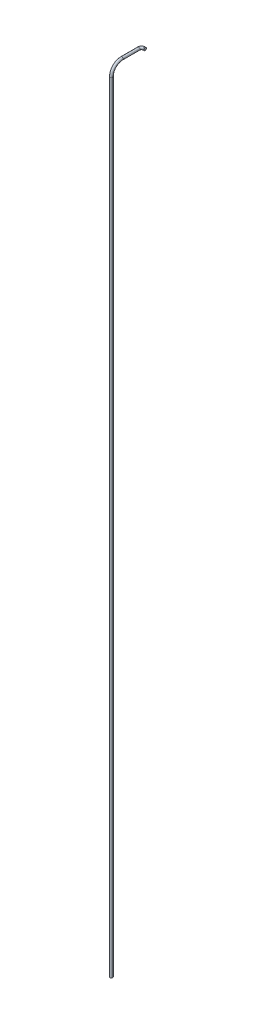
ISO-10303-21;
HEADER;
FILE_DESCRIPTION(('STEP AP214'),'2;1');
FILE_NAME('part.step','',(''),(''),'','','');
FILE_SCHEMA(('AUTOMOTIVE_DESIGN { 1 0 10303 214 1 1 1 1 }'));
ENDSEC;
DATA;
#1=APPLICATION_CONTEXT('core data for automotive mechanical design processes');
#2=APPLICATION_PROTOCOL_DEFINITION('international standard','automotive_design',2000,#1);
#3=PRODUCT_CONTEXT('',#1,'mechanical');
#4=PRODUCT('Part','Part','',(#3));
#5=PRODUCT_RELATED_PRODUCT_CATEGORY('part','',(#4));
#6=PRODUCT_DEFINITION_FORMATION('','',#4);
#7=PRODUCT_DEFINITION_CONTEXT('part definition',#1,'design');
#8=PRODUCT_DEFINITION('design','',#6,#7);
#9=PRODUCT_DEFINITION_SHAPE('','',#8);
#10=(LENGTH_UNIT() NAMED_UNIT(*) SI_UNIT(.MILLI.,.METRE.));
#11=(NAMED_UNIT(*) PLANE_ANGLE_UNIT() SI_UNIT($,.RADIAN.));
#12=(NAMED_UNIT(*) SI_UNIT($,.STERADIAN.) SOLID_ANGLE_UNIT());
#13=UNCERTAINTY_MEASURE_WITH_UNIT(LENGTH_MEASURE(1.E-05),#10,'distance_accuracy_value','');
#14=(GEOMETRIC_REPRESENTATION_CONTEXT(3) GLOBAL_UNCERTAINTY_ASSIGNED_CONTEXT((#13)) GLOBAL_UNIT_ASSIGNED_CONTEXT((#10,
#11,#12)) REPRESENTATION_CONTEXT('',''));
#15=CARTESIAN_POINT('',(0.,0.,0.));
#16=DIRECTION('',(0.,0.,1.));
#17=DIRECTION('',(1.,0.,0.));
#18=AXIS2_PLACEMENT_3D('',#15,#16,#17);
#19=CARTESIAN_POINT('',(0.,-1500.,49.9999999999998));
#20=DIRECTION('',(0.,1.,0.));
#21=DIRECTION('',(0.,0.,1.));
#22=AXIS2_PLACEMENT_3D('',#19,#20,#21);
#23=PLANE('',#22);
#24=CARTESIAN_POINT('',(0.,-1500.,49.9999999999998));
#25=DIRECTION('',(0.,1.,0.));
#26=DIRECTION('',(0.,0.,1.));
#27=AXIS2_PLACEMENT_3D('',#24,#25,#26);
#28=CIRCLE('',#27,2.5);
#29=CARTESIAN_POINT('',(0.,-1500.,52.4999999999998));
#30=VERTEX_POINT('',#29);
#31=EDGE_CURVE('E12',#30,#30,#28,.T.);
#32=ORIENTED_EDGE('',*,*,#31,.F.);
#33=EDGE_LOOP('',(#32));
#34=FACE_BOUND('',#33,.T.);
#35=ADVANCED_FACE('F58',(#34),#23,.F.);
#36=CARTESIAN_POINT('',(0.,0.,0.));
#37=DIRECTION('',(0.,0.,1.));
#38=DIRECTION('',(0.,-1.,0.));
#39=AXIS2_PLACEMENT_3D('',#36,#37,#38);
#40=CYLINDRICAL_SURFACE('',#39,2.5);
#41=CARTESIAN_POINT('',(0.,0.,30.));
#42=DIRECTION('',(0.,0.,-1.));
#43=DIRECTION('',(0.,1.,0.));
#44=AXIS2_PLACEMENT_3D('',#41,#42,#43);
#45=CIRCLE('',#44,2.5);
#46=CARTESIAN_POINT('',(0.,2.49999999999999,30.));
#47=VERTEX_POINT('',#46);
#48=EDGE_CURVE('E76',#47,#47,#45,.T.);
#49=ORIENTED_EDGE('',*,*,#48,.T.);
#50=EDGE_LOOP('',(#49));
#51=FACE_BOUND('',#50,.T.);
#52=CARTESIAN_POINT('',(0.,0.,-2.));
#53=DIRECTION('',(0.,0.,1.));
#54=DIRECTION('',(1.,0.,0.));
#55=AXIS2_PLACEMENT_3D('',#52,#53,#54);
#56=CIRCLE('',#55,2.5);
#57=CARTESIAN_POINT('',(-2.5,0.,-2.));
#58=VERTEX_POINT('',#57);
#59=EDGE_CURVE('E82',#58,#58,#56,.T.);
#60=ORIENTED_EDGE('',*,*,#59,.T.);
#61=EDGE_LOOP('',(#60));
#62=FACE_BOUND('',#61,.T.);
#63=ADVANCED_FACE('F100',(#51,#62),#40,.T.);
#64=CARTESIAN_POINT('',(0.,-20.,30.));
#65=DIRECTION('',(1.,0.,0.));
#66=DIRECTION('',(0.,0.,-1.));
#67=AXIS2_PLACEMENT_3D('',#64,#65,#66);
#68=TOROIDAL_SURFACE('',#67,20.,2.5);
#69=CARTESIAN_POINT('',(0.,-20.,49.9999999999996));
#70=DIRECTION('',(0.,1.,0.));
#71=DIRECTION('',(0.,0.,1.));
#72=AXIS2_PLACEMENT_3D('',#69,#70,#71);
#73=CIRCLE('',#72,2.5);
#74=CARTESIAN_POINT('',(0.,-20.,52.5));
#75=VERTEX_POINT('',#74);
#76=EDGE_CURVE('E65',#75,#75,#73,.T.);
#77=CARTESIAN_POINT('',(0.,-20.,30.));
#78=DIRECTION('',(1.,0.,0.));
#79=DIRECTION('',(0.,0.,-1.));
#80=AXIS2_PLACEMENT_3D('',#77,#78,#79);
#81=CIRCLE('',#80,22.5);
#82=EDGE_CURVE('',#47,#75,#81,.T.);
#83=ORIENTED_EDGE('',*,*,#48,.F.);
#84=ORIENTED_EDGE('',*,*,#76,.T.);
#85=ORIENTED_EDGE('',*,*,#82,.T.);
#86=ORIENTED_EDGE('',*,*,#82,.F.);
#87=EDGE_LOOP('',(#83,#85,#84,#86));
#88=FACE_BOUND('',#87,.T.);
#89=ADVANCED_FACE('F88',(#88),#68,.T.);
#90=CARTESIAN_POINT('',(0.,-20.,50.));
#91=DIRECTION('',(0.,-1.,0.));
#92=DIRECTION('',(0.,0.,-1.));
#93=AXIS2_PLACEMENT_3D('',#90,#91,#92);
#94=CYLINDRICAL_SURFACE('',#93,2.5);
#95=ORIENTED_EDGE('',*,*,#31,.T.);
#96=EDGE_LOOP('',(#95));
#97=FACE_BOUND('',#96,.T.);
#98=ORIENTED_EDGE('',*,*,#76,.F.);
#99=EDGE_LOOP('',(#98));
#100=FACE_BOUND('',#99,.T.);
#101=ADVANCED_FACE('F91',(#97,#100),#94,.T.);
#102=CARTESIAN_POINT('',(6.99658834039425,0.,-7.));
#103=DIRECTION('',(-1.,0.,0.));
#104=DIRECTION('',(0.,0.,1.));
#105=AXIS2_PLACEMENT_3D('',#102,#103,#104);
#106=PLANE('',#105);
#107=CARTESIAN_POINT('',(6.99658834039425,0.,-7.));
#108=DIRECTION('',(-1.,0.,0.));
#109=DIRECTION('',(0.,0.,1.));
#110=AXIS2_PLACEMENT_3D('',#107,#108,#109);
#111=CIRCLE('',#110,2.5);
#112=CARTESIAN_POINT('',(6.99658834039425,0.,-4.5));
#113=VERTEX_POINT('',#112);
#114=EDGE_CURVE('E72',#113,#113,#111,.T.);
#115=ORIENTED_EDGE('',*,*,#114,.F.);
#116=EDGE_LOOP('',(#115));
#117=FACE_BOUND('',#116,.T.);
#118=ADVANCED_FACE('F93',(#117),#106,.F.);
#119=CARTESIAN_POINT('',(5.,0.,-2.));
#120=DIRECTION('',(0.,-1.,0.));
#121=DIRECTION('',(0.,0.,-1.));
#122=AXIS2_PLACEMENT_3D('',#119,#120,#121);
#123=TOROIDAL_SURFACE('',#122,5.,2.5);
#124=CARTESIAN_POINT('',(5.,0.,-7.));
#125=DIRECTION('',(-1.,0.,0.));
#126=DIRECTION('',(0.,0.,1.));
#127=AXIS2_PLACEMENT_3D('',#124,#125,#126);
#128=CIRCLE('',#127,2.5);
#129=CARTESIAN_POINT('',(4.99999999999999,0.,-9.5));
#130=VERTEX_POINT('',#129);
#131=EDGE_CURVE('E77',#130,#130,#128,.T.);
#132=CARTESIAN_POINT('',(5.,0.,-2.));
#133=DIRECTION('',(0.,-1.,0.));
#134=DIRECTION('',(0.,0.,-1.));
#135=AXIS2_PLACEMENT_3D('',#132,#133,#134);
#136=CIRCLE('',#135,7.5);
#137=EDGE_CURVE('',#58,#130,#136,.T.);
#138=ORIENTED_EDGE('',*,*,#59,.F.);
#139=ORIENTED_EDGE('',*,*,#131,.T.);
#140=ORIENTED_EDGE('',*,*,#137,.T.);
#141=ORIENTED_EDGE('',*,*,#137,.F.);
#142=EDGE_LOOP('',(#138,#140,#139,#141));
#143=FACE_BOUND('',#142,.T.);
#144=ADVANCED_FACE('F98',(#143),#123,.T.);
#145=CARTESIAN_POINT('',(5.,0.,-7.));
#146=DIRECTION('',(1.,0.,0.));
#147=DIRECTION('',(0.,0.,-1.));
#148=AXIS2_PLACEMENT_3D('',#145,#146,#147);
#149=CYLINDRICAL_SURFACE('',#148,2.5);
#150=ORIENTED_EDGE('',*,*,#114,.T.);
#151=EDGE_LOOP('',(#150));
#152=FACE_BOUND('',#151,.T.);
#153=ORIENTED_EDGE('',*,*,#131,.F.);
#154=EDGE_LOOP('',(#153));
#155=FACE_BOUND('',#154,.T.);
#156=ADVANCED_FACE('F73',(#152,#155),#149,.T.);
#157=CLOSED_SHELL('',(#35,#63,#89,#101,#118,#144,#156));
#158=MANIFOLD_SOLID_BREP('B2',#157);
#159=ADVANCED_BREP_SHAPE_REPRESENTATION('',(#18,#158),#14);
#160=SHAPE_DEFINITION_REPRESENTATION(#9,#159);
ENDSEC;
END-ISO-10303-21;
